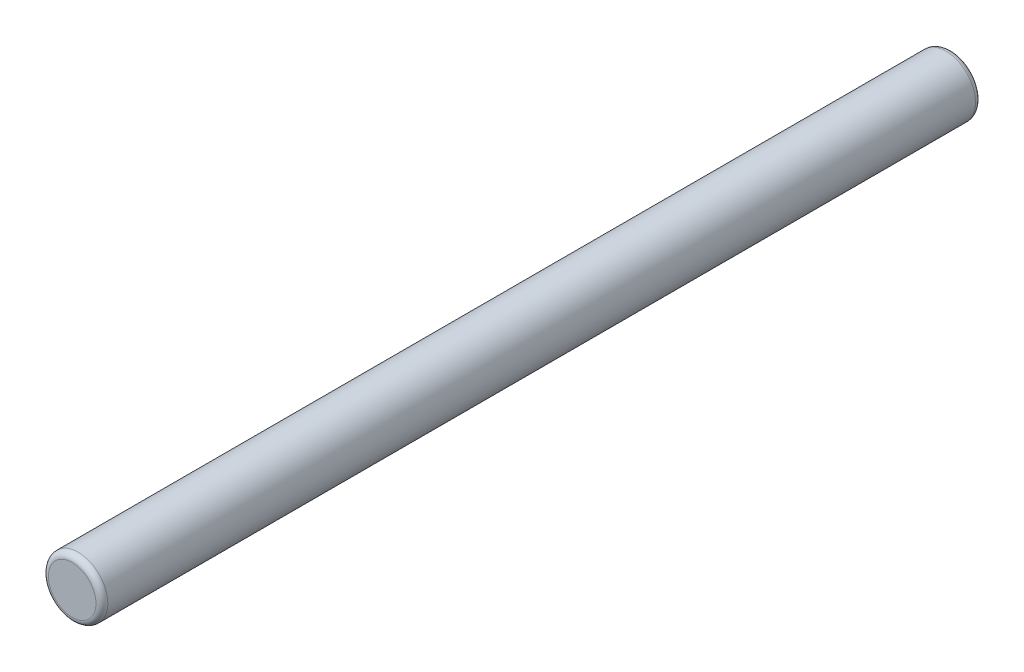
ISO-10303-21;
HEADER;
FILE_DESCRIPTION(('STEP AP214'),'2;1');
FILE_NAME('part.step','',(''),(''),'','','');
FILE_SCHEMA(('AUTOMOTIVE_DESIGN { 1 0 10303 214 1 1 1 1 }'));
ENDSEC;
DATA;
#1=APPLICATION_CONTEXT('core data for automotive mechanical design processes');
#2=APPLICATION_PROTOCOL_DEFINITION('international standard','automotive_design',2000,#1);
#3=PRODUCT_CONTEXT('',#1,'mechanical');
#4=PRODUCT('Part','Part','',(#3));
#5=PRODUCT_RELATED_PRODUCT_CATEGORY('part','',(#4));
#6=PRODUCT_DEFINITION_FORMATION('','',#4);
#7=PRODUCT_DEFINITION_CONTEXT('part definition',#1,'design');
#8=PRODUCT_DEFINITION('design','',#6,#7);
#9=PRODUCT_DEFINITION_SHAPE('','',#8);
#10=(LENGTH_UNIT() NAMED_UNIT(*) SI_UNIT(.MILLI.,.METRE.));
#11=(NAMED_UNIT(*) PLANE_ANGLE_UNIT() SI_UNIT($,.RADIAN.));
#12=(NAMED_UNIT(*) SI_UNIT($,.STERADIAN.) SOLID_ANGLE_UNIT());
#13=UNCERTAINTY_MEASURE_WITH_UNIT(LENGTH_MEASURE(1.E-05),#10,'distance_accuracy_value','');
#14=(GEOMETRIC_REPRESENTATION_CONTEXT(3) GLOBAL_UNCERTAINTY_ASSIGNED_CONTEXT((#13)) GLOBAL_UNIT_ASSIGNED_CONTEXT((#10,
#11,#12)) REPRESENTATION_CONTEXT('',''));
#15=CARTESIAN_POINT('',(0.,0.,0.));
#16=DIRECTION('',(0.,0.,1.));
#17=DIRECTION('',(1.,0.,0.));
#18=AXIS2_PLACEMENT_3D('',#15,#16,#17);
#19=CARTESIAN_POINT('',(0.,0.,7.4));
#20=DIRECTION('',(0.,0.,-1.));
#21=DIRECTION('',(-1.,0.,0.));
#22=AXIS2_PLACEMENT_3D('',#19,#20,#21);
#23=CYLINDRICAL_SURFACE('',#22,0.5);
#24=CARTESIAN_POINT('',(0.,0.,7.3));
#25=DIRECTION('',(0.,0.,1.));
#26=DIRECTION('',(1.,0.,0.));
#27=AXIS2_PLACEMENT_3D('',#24,#25,#26);
#28=CIRCLE('',#27,0.5);
#29=CARTESIAN_POINT('',(0.5,0.,7.3));
#30=VERTEX_POINT('',#29);
#31=EDGE_CURVE('E38',#30,#30,#28,.F.);
#32=ORIENTED_EDGE('',*,*,#31,.T.);
#33=EDGE_LOOP('',(#32));
#34=FACE_BOUND('',#33,.T.);
#35=CARTESIAN_POINT('',(0.,0.,-7.3));
#36=DIRECTION('',(0.,0.,1.));
#37=DIRECTION('',(1.,0.,0.));
#38=AXIS2_PLACEMENT_3D('',#35,#36,#37);
#39=CIRCLE('',#38,0.5);
#40=CARTESIAN_POINT('',(0.5,0.,-7.3));
#41=VERTEX_POINT('',#40);
#42=EDGE_CURVE('E42',#41,#41,#39,.T.);
#43=ORIENTED_EDGE('',*,*,#42,.T.);
#44=EDGE_LOOP('',(#43));
#45=FACE_BOUND('',#44,.T.);
#46=ADVANCED_FACE('F31',(#34,#45),#23,.T.);
#47=CARTESIAN_POINT('',(0.,0.,7.4));
#48=DIRECTION('',(0.,0.,1.));
#49=DIRECTION('',(1.,0.,0.));
#50=AXIS2_PLACEMENT_3D('',#47,#48,#49);
#51=PLANE('',#50);
#52=CARTESIAN_POINT('',(0.,0.,7.4));
#53=DIRECTION('',(0.,0.,1.));
#54=DIRECTION('',(1.,0.,0.));
#55=AXIS2_PLACEMENT_3D('',#52,#53,#54);
#56=CIRCLE('',#55,0.4);
#57=CARTESIAN_POINT('',(0.4,0.,7.4));
#58=VERTEX_POINT('',#57);
#59=EDGE_CURVE('E46',#58,#58,#56,.T.);
#60=ORIENTED_EDGE('',*,*,#59,.T.);
#61=EDGE_LOOP('',(#60));
#62=FACE_BOUND('',#61,.T.);
#63=ADVANCED_FACE('F52',(#62),#51,.T.);
#64=CARTESIAN_POINT('',(0.,0.,-7.4));
#65=DIRECTION('',(0.,0.,1.));
#66=DIRECTION('',(1.,0.,0.));
#67=AXIS2_PLACEMENT_3D('',#64,#65,#66);
#68=PLANE('',#67);
#69=CARTESIAN_POINT('',(0.,0.,-7.4));
#70=DIRECTION('',(0.,0.,1.));
#71=DIRECTION('',(1.,0.,0.));
#72=AXIS2_PLACEMENT_3D('',#69,#70,#71);
#73=CIRCLE('',#72,0.4);
#74=CARTESIAN_POINT('',(0.4,0.,-7.4));
#75=VERTEX_POINT('',#74);
#76=EDGE_CURVE('E10',#75,#75,#73,.F.);
#77=ORIENTED_EDGE('',*,*,#76,.T.);
#78=EDGE_LOOP('',(#77));
#79=FACE_BOUND('',#78,.T.);
#80=ADVANCED_FACE('F56',(#79),#68,.F.);
#81=CARTESIAN_POINT('',(0.,0.,7.3));
#82=DIRECTION('',(0.,0.,1.));
#83=DIRECTION('',(1.,0.,0.));
#84=AXIS2_PLACEMENT_3D('',#81,#82,#83);
#85=TOROIDAL_SURFACE('',#84,0.4,0.1);
#86=ORIENTED_EDGE('',*,*,#31,.F.);
#87=EDGE_LOOP('',(#86));
#88=FACE_BOUND('',#87,.T.);
#89=ORIENTED_EDGE('',*,*,#59,.F.);
#90=EDGE_LOOP('',(#89));
#91=FACE_BOUND('',#90,.T.);
#92=ADVANCED_FACE('F54',(#88,#91),#85,.T.);
#93=CARTESIAN_POINT('',(0.,0.,-7.3));
#94=DIRECTION('',(0.,0.,1.));
#95=DIRECTION('',(1.,0.,0.));
#96=AXIS2_PLACEMENT_3D('',#93,#94,#95);
#97=TOROIDAL_SURFACE('',#96,0.4,0.1);
#98=ORIENTED_EDGE('',*,*,#76,.F.);
#99=EDGE_LOOP('',(#98));
#100=FACE_BOUND('',#99,.T.);
#101=ORIENTED_EDGE('',*,*,#42,.F.);
#102=EDGE_LOOP('',(#101));
#103=FACE_BOUND('',#102,.T.);
#104=ADVANCED_FACE('F33',(#100,#103),#97,.T.);
#105=CLOSED_SHELL('',(#46,#63,#80,#92,#104));
#106=MANIFOLD_SOLID_BREP('B2',#105);
#107=ADVANCED_BREP_SHAPE_REPRESENTATION('',(#18,#106),#14);
#108=SHAPE_DEFINITION_REPRESENTATION(#9,#107);
ENDSEC;
END-ISO-10303-21;
